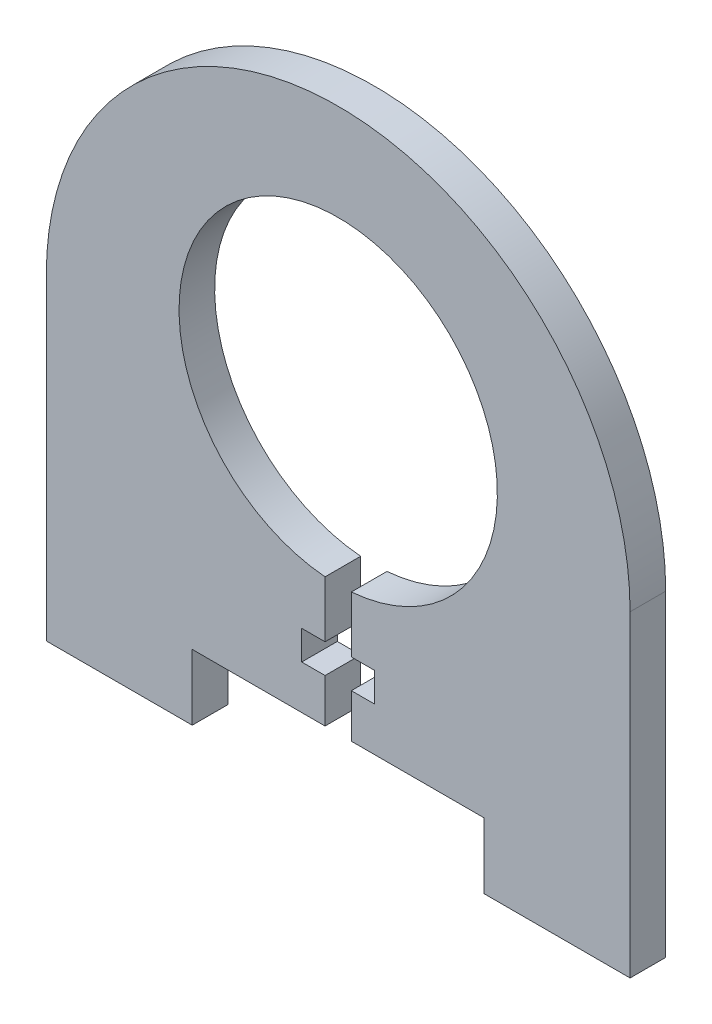
ISO-10303-21;
HEADER;
FILE_DESCRIPTION(('STEP AP214'),'2;1');
FILE_NAME('part.step','',(''),(''),'','','');
FILE_SCHEMA(('AUTOMOTIVE_DESIGN { 1 0 10303 214 1 1 1 1 }'));
ENDSEC;
DATA;
#1=APPLICATION_CONTEXT('core data for automotive mechanical design processes');
#2=APPLICATION_PROTOCOL_DEFINITION('international standard','automotive_design',2000,#1);
#3=PRODUCT_CONTEXT('',#1,'mechanical');
#4=PRODUCT('Part','Part','',(#3));
#5=PRODUCT_RELATED_PRODUCT_CATEGORY('part','',(#4));
#6=PRODUCT_DEFINITION_FORMATION('','',#4);
#7=PRODUCT_DEFINITION_CONTEXT('part definition',#1,'design');
#8=PRODUCT_DEFINITION('design','',#6,#7);
#9=PRODUCT_DEFINITION_SHAPE('','',#8);
#10=(LENGTH_UNIT() NAMED_UNIT(*) SI_UNIT(.MILLI.,.METRE.));
#11=(NAMED_UNIT(*) PLANE_ANGLE_UNIT() SI_UNIT($,.RADIAN.));
#12=(NAMED_UNIT(*) SI_UNIT($,.STERADIAN.) SOLID_ANGLE_UNIT());
#13=UNCERTAINTY_MEASURE_WITH_UNIT(LENGTH_MEASURE(1.E-05),#10,'distance_accuracy_value','');
#14=(GEOMETRIC_REPRESENTATION_CONTEXT(3) GLOBAL_UNCERTAINTY_ASSIGNED_CONTEXT((#13)) GLOBAL_UNIT_ASSIGNED_CONTEXT((#10,
#11,#12)) REPRESENTATION_CONTEXT('',''));
#15=CARTESIAN_POINT('',(0.,0.,0.));
#16=DIRECTION('',(0.,0.,1.));
#17=DIRECTION('',(1.,0.,0.));
#18=AXIS2_PLACEMENT_3D('',#15,#16,#17);
#19=CARTESIAN_POINT('',(-12.7,-8.08507996900001,-0.00100000000000013));
#20=DIRECTION('',(0.,1.,0.));
#21=DIRECTION('',(0.,0.,1.));
#22=AXIS2_PLACEMENT_3D('',#19,#20,#21);
#23=PLANE('',#22);
#24=DIRECTION('',(-1.,0.,0.));
#25=VECTOR('',#24,1.);
#26=CARTESIAN_POINT('',(-12.7,-8.08507996900001,3.0988));
#27=LINE('',#26,#25);
#28=CARTESIAN_POINT('',(12.7,-8.08507996900001,3.0988));
#29=VERTEX_POINT('',#28);
#30=CARTESIAN_POINT('',(1.143,-8.08507996900001,3.0988));
#31=VERTEX_POINT('',#30);
#32=EDGE_CURVE('E211',#29,#31,#27,.T.);
#33=ORIENTED_EDGE('',*,*,#32,.T.);
#34=DIRECTION('',(0.,0.,1.));
#35=VECTOR('',#34,1.);
#36=CARTESIAN_POINT('',(1.143,-8.08507996900001,-0.00100000000000013));
#37=LINE('',#36,#35);
#38=CARTESIAN_POINT('',(1.143,-8.08507996900001,0.));
#39=VERTEX_POINT('',#38);
#40=EDGE_CURVE('E176',#39,#31,#37,.T.);
#41=ORIENTED_EDGE('',*,*,#40,.F.);
#42=DIRECTION('',(-1.,0.,0.));
#43=VECTOR('',#42,1.);
#44=CARTESIAN_POINT('',(-12.7,-8.08507996900001,0.));
#45=LINE('',#44,#43);
#46=CARTESIAN_POINT('',(12.7,-8.08507996900001,0.));
#47=VERTEX_POINT('',#46);
#48=EDGE_CURVE('E194',#47,#39,#45,.T.);
#49=ORIENTED_EDGE('',*,*,#48,.F.);
#50=DIRECTION('',(0.,0.,1.));
#51=VECTOR('',#50,1.);
#52=CARTESIAN_POINT('',(12.7,-8.08507996900001,-0.00100000000000013));
#53=LINE('',#52,#51);
#54=EDGE_CURVE('E217',#47,#29,#53,.T.);
#55=ORIENTED_EDGE('',*,*,#54,.T.);
#56=EDGE_LOOP('',(#33,#41,#49,#55));
#57=FACE_BOUND('',#56,.T.);
#58=ADVANCED_FACE('F33',(#57),#23,.F.);
#59=CARTESIAN_POINT('',(25.4,-13.800079969,3.0988));
#60=DIRECTION('',(0.,1.,0.));
#61=DIRECTION('',(-1.,0.,0.));
#62=AXIS2_PLACEMENT_3D('',#59,#60,#61);
#63=PLANE('',#62);
#64=DIRECTION('',(1.,0.,0.));
#65=VECTOR('',#64,1.);
#66=CARTESIAN_POINT('',(25.4,-13.800079969,0.));
#67=LINE('',#66,#65);
#68=CARTESIAN_POINT('',(-25.4,-13.800079969,0.));
#69=VERTEX_POINT('',#68);
#70=CARTESIAN_POINT('',(-12.7,-13.800079969,0.));
#71=VERTEX_POINT('',#70);
#72=EDGE_CURVE('E247',#69,#71,#67,.T.);
#73=ORIENTED_EDGE('',*,*,#72,.T.);
#74=DIRECTION('',(0.,0.,1.));
#75=VECTOR('',#74,1.);
#76=CARTESIAN_POINT('',(-12.7,-13.800079969,-0.00100000000000013));
#77=LINE('',#76,#75);
#78=CARTESIAN_POINT('',(-12.7,-13.800079969,3.0988));
#79=VERTEX_POINT('',#78);
#80=EDGE_CURVE('E214',#71,#79,#77,.T.);
#81=ORIENTED_EDGE('',*,*,#80,.T.);
#82=DIRECTION('',(1.,0.,0.));
#83=VECTOR('',#82,1.);
#84=CARTESIAN_POINT('',(25.4,-13.800079969,3.0988));
#85=LINE('',#84,#83);
#86=CARTESIAN_POINT('',(-25.4,-13.800079969,3.0988));
#87=VERTEX_POINT('',#86);
#88=EDGE_CURVE('E236',#87,#79,#85,.T.);
#89=ORIENTED_EDGE('',*,*,#88,.F.);
#90=DIRECTION('',(0.,0.,-1.));
#91=VECTOR('',#90,1.);
#92=CARTESIAN_POINT('',(-25.4,-13.800079969,3.0988));
#93=LINE('',#92,#91);
#94=EDGE_CURVE('E41',#87,#69,#93,.T.);
#95=ORIENTED_EDGE('',*,*,#94,.T.);
#96=EDGE_LOOP('',(#73,#81,#89,#95));
#97=FACE_BOUND('',#96,.T.);
#98=ADVANCED_FACE('F260',(#97),#63,.F.);
#99=CARTESIAN_POINT('',(0.,13.800079969,3.0988));
#100=DIRECTION('',(0.,0.,-1.));
#101=DIRECTION('',(-1.,0.,0.));
#102=AXIS2_PLACEMENT_3D('',#99,#100,#101);
#103=CYLINDRICAL_SURFACE('',#102,25.4);
#104=CARTESIAN_POINT('',(0.,13.800079969,0.));
#105=DIRECTION('',(0.,0.,1.));
#106=DIRECTION('',(-1.,0.,0.));
#107=AXIS2_PLACEMENT_3D('',#104,#105,#106);
#108=CIRCLE('',#107,25.4);
#109=CARTESIAN_POINT('',(25.4,13.800079969,0.));
#110=VERTEX_POINT('',#109);
#111=CARTESIAN_POINT('',(-25.4,13.800079969,0.));
#112=VERTEX_POINT('',#111);
#113=EDGE_CURVE('E226',#110,#112,#108,.T.);
#114=ORIENTED_EDGE('',*,*,#113,.T.);
#115=DIRECTION('',(0.,0.,-1.));
#116=VECTOR('',#115,1.);
#117=CARTESIAN_POINT('',(-25.4,13.800079969,3.0988));
#118=LINE('',#117,#116);
#119=CARTESIAN_POINT('',(-25.4,13.800079969,3.0988));
#120=VERTEX_POINT('',#119);
#121=EDGE_CURVE('E11',#120,#112,#118,.T.);
#122=ORIENTED_EDGE('',*,*,#121,.F.);
#123=CARTESIAN_POINT('',(0.,13.800079969,3.0988));
#124=DIRECTION('',(0.,0.,1.));
#125=DIRECTION('',(-1.,0.,0.));
#126=AXIS2_PLACEMENT_3D('',#123,#124,#125);
#127=CIRCLE('',#126,25.4);
#128=CARTESIAN_POINT('',(25.4,13.800079969,3.0988));
#129=VERTEX_POINT('',#128);
#130=EDGE_CURVE('E229',#129,#120,#127,.T.);
#131=ORIENTED_EDGE('',*,*,#130,.F.);
#132=DIRECTION('',(0.,0.,-1.));
#133=VECTOR('',#132,1.);
#134=CARTESIAN_POINT('',(25.4,13.800079969,3.0988));
#135=LINE('',#134,#133);
#136=EDGE_CURVE('E241',#129,#110,#135,.T.);
#137=ORIENTED_EDGE('',*,*,#136,.T.);
#138=EDGE_LOOP('',(#114,#122,#131,#137));
#139=FACE_BOUND('',#138,.T.);
#140=ADVANCED_FACE('F35',(#139),#103,.T.);
#141=CARTESIAN_POINT('',(-25.4,-13.800079969,3.0988));
#142=DIRECTION('',(1.,0.,0.));
#143=DIRECTION('',(0.,1.,0.));
#144=AXIS2_PLACEMENT_3D('',#141,#142,#143);
#145=PLANE('',#144);
#146=DIRECTION('',(0.,-1.,0.));
#147=VECTOR('',#146,1.);
#148=CARTESIAN_POINT('',(-25.4,-13.800079969,0.));
#149=LINE('',#148,#147);
#150=EDGE_CURVE('E244',#112,#69,#149,.T.);
#151=ORIENTED_EDGE('',*,*,#150,.T.);
#152=ORIENTED_EDGE('',*,*,#94,.F.);
#153=DIRECTION('',(0.,-1.,0.));
#154=VECTOR('',#153,1.);
#155=CARTESIAN_POINT('',(-25.4,-13.800079969,3.0988));
#156=LINE('',#155,#154);
#157=EDGE_CURVE('E232',#120,#87,#156,.T.);
#158=ORIENTED_EDGE('',*,*,#157,.F.);
#159=ORIENTED_EDGE('',*,*,#121,.T.);
#160=EDGE_LOOP('',(#151,#152,#158,#159));
#161=FACE_BOUND('',#160,.T.);
#162=ADVANCED_FACE('F271',(#161),#145,.F.);
#163=CARTESIAN_POINT('',(12.7,-13.800079969,3.0988));
#164=VERTEX_POINT('',#163);
#165=CARTESIAN_POINT('',(25.4,-13.800079969,3.0988));
#166=VERTEX_POINT('',#165);
#167=EDGE_CURVE('E235',#164,#166,#85,.T.);
#168=ORIENTED_EDGE('',*,*,#167,.F.);
#169=DIRECTION('',(0.,0.,1.));
#170=VECTOR('',#169,1.);
#171=CARTESIAN_POINT('',(12.7,-13.800079969,-0.00100000000000013));
#172=LINE('',#171,#170);
#173=CARTESIAN_POINT('',(12.7,-13.800079969,0.));
#174=VERTEX_POINT('',#173);
#175=EDGE_CURVE('E219',#174,#164,#172,.T.);
#176=ORIENTED_EDGE('',*,*,#175,.F.);
#177=CARTESIAN_POINT('',(25.4,-13.800079969,0.));
#178=VERTEX_POINT('',#177);
#179=EDGE_CURVE('E246',#174,#178,#67,.T.);
#180=ORIENTED_EDGE('',*,*,#179,.T.);
#181=DIRECTION('',(0.,0.,-1.));
#182=VECTOR('',#181,1.);
#183=CARTESIAN_POINT('',(25.4,-13.800079969,3.0988));
#184=LINE('',#183,#182);
#185=EDGE_CURVE('E253',#166,#178,#184,.T.);
#186=ORIENTED_EDGE('',*,*,#185,.F.);
#187=EDGE_LOOP('',(#168,#176,#180,#186));
#188=FACE_BOUND('',#187,.T.);
#189=ADVANCED_FACE('F282',(#188),#63,.F.);
#190=CARTESIAN_POINT('',(25.4,-13.800079969,3.0988));
#191=DIRECTION('',(-1.,0.,0.));
#192=DIRECTION('',(0.,-1.,0.));
#193=AXIS2_PLACEMENT_3D('',#190,#191,#192);
#194=PLANE('',#193);
#195=DIRECTION('',(0.,1.,0.));
#196=VECTOR('',#195,1.);
#197=CARTESIAN_POINT('',(25.4,-13.800079969,0.));
#198=LINE('',#197,#196);
#199=EDGE_CURVE('E233',#178,#110,#198,.T.);
#200=ORIENTED_EDGE('',*,*,#199,.T.);
#201=ORIENTED_EDGE('',*,*,#136,.F.);
#202=DIRECTION('',(0.,1.,0.));
#203=VECTOR('',#202,1.);
#204=CARTESIAN_POINT('',(25.4,-13.800079969,3.0988));
#205=LINE('',#204,#203);
#206=EDGE_CURVE('E239',#166,#129,#205,.T.);
#207=ORIENTED_EDGE('',*,*,#206,.F.);
#208=ORIENTED_EDGE('',*,*,#185,.T.);
#209=EDGE_LOOP('',(#200,#201,#207,#208));
#210=FACE_BOUND('',#209,.T.);
#211=ADVANCED_FACE('F277',(#210),#194,.F.);
#212=CARTESIAN_POINT('',(0.,13.800079969,3.0988));
#213=DIRECTION('',(0.,0.,-1.));
#214=DIRECTION('',(-1.,0.,0.));
#215=AXIS2_PLACEMENT_3D('',#212,#213,#214);
#216=PLANE('',#215);
#217=CARTESIAN_POINT('',(0.,16.964919969,3.0988));
#218=DIRECTION('',(0.,0.,1.));
#219=DIRECTION('',(1.,0.,0.));
#220=AXIS2_PLACEMENT_3D('',#217,#218,#219);
#221=CIRCLE('',#220,13.85);
#222=CARTESIAN_POINT('',(1.143,3.16216477302552,3.0988));
#223=VERTEX_POINT('',#222);
#224=CARTESIAN_POINT('',(-1.143,3.16216477302553,3.0988));
#225=VERTEX_POINT('',#224);
#226=EDGE_CURVE('E223',#223,#225,#221,.T.);
#227=ORIENTED_EDGE('',*,*,#226,.F.);
#228=DIRECTION('',(0.,1.,0.));
#229=VECTOR('',#228,1.);
#230=CARTESIAN_POINT('',(1.143,-1.73507996900001,3.0988));
#231=LINE('',#230,#229);
#232=CARTESIAN_POINT('',(1.143,-1.73507996900001,3.0988));
#233=VERTEX_POINT('',#232);
#234=EDGE_CURVE('E331',#233,#223,#231,.T.);
#235=ORIENTED_EDGE('',*,*,#234,.F.);
#236=DIRECTION('',(-1.,0.,0.));
#237=VECTOR('',#236,1.);
#238=CARTESIAN_POINT('',(3.175,-1.73507996900001,3.0988));
#239=LINE('',#238,#237);
#240=CARTESIAN_POINT('',(3.175,-1.73507996900001,3.0988));
#241=VERTEX_POINT('',#240);
#242=EDGE_CURVE('E328',#241,#233,#239,.T.);
#243=ORIENTED_EDGE('',*,*,#242,.F.);
#244=DIRECTION('',(0.,1.,0.));
#245=VECTOR('',#244,1.);
#246=CARTESIAN_POINT('',(3.175,-4.27507996900001,3.0988));
#247=LINE('',#246,#245);
#248=CARTESIAN_POINT('',(3.175,-4.27507996900001,3.0988));
#249=VERTEX_POINT('',#248);
#250=EDGE_CURVE('E325',#249,#241,#247,.T.);
#251=ORIENTED_EDGE('',*,*,#250,.F.);
#252=DIRECTION('',(1.,0.,0.));
#253=VECTOR('',#252,1.);
#254=CARTESIAN_POINT('',(3.175,-4.27507996900001,3.0988));
#255=LINE('',#254,#253);
#256=CARTESIAN_POINT('',(1.143,-4.27507996900001,3.0988));
#257=VERTEX_POINT('',#256);
#258=EDGE_CURVE('E322',#257,#249,#255,.T.);
#259=ORIENTED_EDGE('',*,*,#258,.F.);
#260=DIRECTION('',(0.,1.,0.));
#261=VECTOR('',#260,1.);
#262=CARTESIAN_POINT('',(1.143,-8.08507996900001,3.0988));
#263=LINE('',#262,#261);
#264=EDGE_CURVE('E291',#31,#257,#263,.T.);
#265=ORIENTED_EDGE('',*,*,#264,.F.);
#266=ORIENTED_EDGE('',*,*,#32,.F.);
#267=DIRECTION('',(0.,1.,0.));
#268=VECTOR('',#267,1.);
#269=CARTESIAN_POINT('',(12.7,-13.800079969,3.0988));
#270=LINE('',#269,#268);
#271=EDGE_CURVE('E207',#164,#29,#270,.T.);
#272=ORIENTED_EDGE('',*,*,#271,.F.);
#273=ORIENTED_EDGE('',*,*,#167,.T.);
#274=ORIENTED_EDGE('',*,*,#206,.T.);
#275=ORIENTED_EDGE('',*,*,#130,.T.);
#276=ORIENTED_EDGE('',*,*,#157,.T.);
#277=ORIENTED_EDGE('',*,*,#88,.T.);
#278=DIRECTION('',(0.,-1.,0.));
#279=VECTOR('',#278,1.);
#280=CARTESIAN_POINT('',(-12.7,-13.800079969,3.0988));
#281=LINE('',#280,#279);
#282=CARTESIAN_POINT('',(-12.7,-8.08507996900001,3.0988));
#283=VERTEX_POINT('',#282);
#284=EDGE_CURVE('E205',#283,#79,#281,.T.);
#285=ORIENTED_EDGE('',*,*,#284,.F.);
#286=CARTESIAN_POINT('',(-1.143,-8.08507996900001,3.0988));
#287=VERTEX_POINT('',#286);
#288=EDGE_CURVE('E210',#287,#283,#27,.T.);
#289=ORIENTED_EDGE('',*,*,#288,.F.);
#290=DIRECTION('',(0.,-1.,0.));
#291=VECTOR('',#290,1.);
#292=CARTESIAN_POINT('',(-1.143,-8.08507996900001,3.0988));
#293=LINE('',#292,#291);
#294=CARTESIAN_POINT('',(-1.143,-4.27507996900001,3.0988));
#295=VERTEX_POINT('',#294);
#296=EDGE_CURVE('E56',#295,#287,#293,.T.);
#297=ORIENTED_EDGE('',*,*,#296,.F.);
#298=DIRECTION('',(1.,0.,0.));
#299=VECTOR('',#298,1.);
#300=CARTESIAN_POINT('',(-1.143,-4.27507996900001,3.0988));
#301=LINE('',#300,#299);
#302=CARTESIAN_POINT('',(-3.17499999999999,-4.27507996900001,3.0988));
#303=VERTEX_POINT('',#302);
#304=EDGE_CURVE('E317',#303,#295,#301,.T.);
#305=ORIENTED_EDGE('',*,*,#304,.F.);
#306=DIRECTION('',(0.,-1.,0.));
#307=VECTOR('',#306,1.);
#308=CARTESIAN_POINT('',(-3.17499999999999,-4.27507996900001,3.0988));
#309=LINE('',#308,#307);
#310=CARTESIAN_POINT('',(-3.17499999999999,-1.73507996900001,3.0988));
#311=VERTEX_POINT('',#310);
#312=EDGE_CURVE('E314',#311,#303,#309,.T.);
#313=ORIENTED_EDGE('',*,*,#312,.F.);
#314=DIRECTION('',(-1.,0.,0.));
#315=VECTOR('',#314,1.);
#316=CARTESIAN_POINT('',(-1.143,-1.73507996900001,3.0988));
#317=LINE('',#316,#315);
#318=CARTESIAN_POINT('',(-1.143,-1.73507996900001,3.0988));
#319=VERTEX_POINT('',#318);
#320=EDGE_CURVE('E311',#319,#311,#317,.T.);
#321=ORIENTED_EDGE('',*,*,#320,.F.);
#322=DIRECTION('',(0.,-1.,0.));
#323=VECTOR('',#322,1.);
#324=CARTESIAN_POINT('',(-1.143,-1.73507996900001,3.0988));
#325=LINE('',#324,#323);
#326=EDGE_CURVE('E333',#225,#319,#325,.T.);
#327=ORIENTED_EDGE('',*,*,#326,.F.);
#328=EDGE_LOOP('',(#227,#235,#243,#251,#259,#265,#266,#272,#273,#274,#275,#276,#277,#285,#289,
#297,#305,#313,#321,#327));
#329=FACE_BOUND('',#328,.T.);
#330=ADVANCED_FACE('F268',(#329),#216,.F.);
#331=CARTESIAN_POINT('',(0.,13.800079969,0.));
#332=DIRECTION('',(0.,0.,-1.));
#333=DIRECTION('',(-1.,0.,0.));
#334=AXIS2_PLACEMENT_3D('',#331,#332,#333);
#335=PLANE('',#334);
#336=DIRECTION('',(0.,1.,0.));
#337=VECTOR('',#336,1.);
#338=CARTESIAN_POINT('',(1.143,-1.73507996900001,0.));
#339=LINE('',#338,#337);
#340=CARTESIAN_POINT('',(1.143,-1.73507996900001,0.));
#341=VERTEX_POINT('',#340);
#342=CARTESIAN_POINT('',(1.143,3.16216477302552,0.));
#343=VERTEX_POINT('',#342);
#344=EDGE_CURVE('E309',#341,#343,#339,.T.);
#345=ORIENTED_EDGE('',*,*,#344,.T.);
#346=CARTESIAN_POINT('',(0.,16.964919969,0.));
#347=DIRECTION('',(0.,0.,-1.));
#348=DIRECTION('',(-1.,0.,0.));
#349=AXIS2_PLACEMENT_3D('',#346,#347,#348);
#350=CIRCLE('',#349,13.85);
#351=CARTESIAN_POINT('',(-1.143,3.16216477302553,0.));
#352=VERTEX_POINT('',#351);
#353=EDGE_CURVE('E216',#343,#352,#350,.F.);
#354=ORIENTED_EDGE('',*,*,#353,.T.);
#355=DIRECTION('',(0.,-1.,0.));
#356=VECTOR('',#355,1.);
#357=CARTESIAN_POINT('',(-1.143,-1.73507996900001,0.));
#358=LINE('',#357,#356);
#359=CARTESIAN_POINT('',(-1.143,-1.73507996900001,0.));
#360=VERTEX_POINT('',#359);
#361=EDGE_CURVE('E297',#352,#360,#358,.T.);
#362=ORIENTED_EDGE('',*,*,#361,.T.);
#363=DIRECTION('',(-1.,0.,0.));
#364=VECTOR('',#363,1.);
#365=CARTESIAN_POINT('',(-1.143,-1.73507996900001,0.));
#366=LINE('',#365,#364);
#367=CARTESIAN_POINT('',(-3.17499999999999,-1.73507996900001,0.));
#368=VERTEX_POINT('',#367);
#369=EDGE_CURVE('E188',#360,#368,#366,.T.);
#370=ORIENTED_EDGE('',*,*,#369,.T.);
#371=DIRECTION('',(0.,-1.,0.));
#372=VECTOR('',#371,1.);
#373=CARTESIAN_POINT('',(-3.17499999999999,-4.27507996900001,0.));
#374=LINE('',#373,#372);
#375=CARTESIAN_POINT('',(-3.17499999999999,-4.27507996900001,0.));
#376=VERTEX_POINT('',#375);
#377=EDGE_CURVE('E200',#368,#376,#374,.T.);
#378=ORIENTED_EDGE('',*,*,#377,.T.);
#379=DIRECTION('',(1.,0.,0.));
#380=VECTOR('',#379,1.);
#381=CARTESIAN_POINT('',(-1.143,-4.27507996900001,0.));
#382=LINE('',#381,#380);
#383=CARTESIAN_POINT('',(-1.143,-4.27507996900001,0.));
#384=VERTEX_POINT('',#383);
#385=EDGE_CURVE('E187',#376,#384,#382,.T.);
#386=ORIENTED_EDGE('',*,*,#385,.T.);
#387=DIRECTION('',(0.,-1.,0.));
#388=VECTOR('',#387,1.);
#389=CARTESIAN_POINT('',(-1.143,-8.08507996900001,0.));
#390=LINE('',#389,#388);
#391=CARTESIAN_POINT('',(-1.143,-8.08507996900001,0.));
#392=VERTEX_POINT('',#391);
#393=EDGE_CURVE('E171',#384,#392,#390,.T.);
#394=ORIENTED_EDGE('',*,*,#393,.T.);
#395=CARTESIAN_POINT('',(-12.7,-8.08507996900001,0.));
#396=VERTEX_POINT('',#395);
#397=EDGE_CURVE('E184',#392,#396,#45,.T.);
#398=ORIENTED_EDGE('',*,*,#397,.T.);
#399=DIRECTION('',(0.,-1.,0.));
#400=VECTOR('',#399,1.);
#401=CARTESIAN_POINT('',(-12.7,-13.800079969,0.));
#402=LINE('',#401,#400);
#403=EDGE_CURVE('E198',#396,#71,#402,.T.);
#404=ORIENTED_EDGE('',*,*,#403,.T.);
#405=ORIENTED_EDGE('',*,*,#72,.F.);
#406=ORIENTED_EDGE('',*,*,#150,.F.);
#407=ORIENTED_EDGE('',*,*,#113,.F.);
#408=ORIENTED_EDGE('',*,*,#199,.F.);
#409=ORIENTED_EDGE('',*,*,#179,.F.);
#410=DIRECTION('',(0.,1.,0.));
#411=VECTOR('',#410,1.);
#412=CARTESIAN_POINT('',(12.7,-13.800079969,0.));
#413=LINE('',#412,#411);
#414=EDGE_CURVE('E195',#174,#47,#413,.T.);
#415=ORIENTED_EDGE('',*,*,#414,.T.);
#416=ORIENTED_EDGE('',*,*,#48,.T.);
#417=DIRECTION('',(0.,1.,0.));
#418=VECTOR('',#417,1.);
#419=CARTESIAN_POINT('',(1.143,-8.08507996900001,0.));
#420=LINE('',#419,#418);
#421=CARTESIAN_POINT('',(1.143,-4.27507996900001,0.));
#422=VERTEX_POINT('',#421);
#423=EDGE_CURVE('E48',#39,#422,#420,.T.);
#424=ORIENTED_EDGE('',*,*,#423,.T.);
#425=DIRECTION('',(1.,0.,0.));
#426=VECTOR('',#425,1.);
#427=CARTESIAN_POINT('',(3.175,-4.27507996900001,0.));
#428=LINE('',#427,#426);
#429=CARTESIAN_POINT('',(3.175,-4.27507996900001,0.));
#430=VERTEX_POINT('',#429);
#431=EDGE_CURVE('E296',#422,#430,#428,.T.);
#432=ORIENTED_EDGE('',*,*,#431,.T.);
#433=DIRECTION('',(0.,1.,0.));
#434=VECTOR('',#433,1.);
#435=CARTESIAN_POINT('',(3.175,-4.27507996900001,0.));
#436=LINE('',#435,#434);
#437=CARTESIAN_POINT('',(3.175,-1.73507996900001,0.));
#438=VERTEX_POINT('',#437);
#439=EDGE_CURVE('E299',#430,#438,#436,.T.);
#440=ORIENTED_EDGE('',*,*,#439,.T.);
#441=DIRECTION('',(-1.,0.,0.));
#442=VECTOR('',#441,1.);
#443=CARTESIAN_POINT('',(3.175,-1.73507996900001,0.));
#444=LINE('',#443,#442);
#445=EDGE_CURVE('E306',#438,#341,#444,.T.);
#446=ORIENTED_EDGE('',*,*,#445,.T.);
#447=EDGE_LOOP('',(#345,#354,#362,#370,#378,#386,#394,#398,#404,#405,#406,#407,#408,#409,#415,
#416,#424,#432,#440,#446));
#448=FACE_BOUND('',#447,.T.);
#449=ADVANCED_FACE('F182',(#448),#335,.T.);
#450=CARTESIAN_POINT('',(0.,16.964919969,-0.00100000000000013));
#451=DIRECTION('',(0.,0.,1.));
#452=DIRECTION('',(1.,0.,0.));
#453=AXIS2_PLACEMENT_3D('',#450,#451,#452);
#454=CYLINDRICAL_SURFACE('',#453,13.85);
#455=ORIENTED_EDGE('',*,*,#226,.T.);
#456=DIRECTION('',(0.,0.,1.));
#457=VECTOR('',#456,1.);
#458=CARTESIAN_POINT('',(-1.143,3.16216477302553,-0.00100000000000013));
#459=LINE('',#458,#457);
#460=EDGE_CURVE('E365',#352,#225,#459,.T.);
#461=ORIENTED_EDGE('',*,*,#460,.F.);
#462=ORIENTED_EDGE('',*,*,#353,.F.);
#463=DIRECTION('',(0.,0.,1.));
#464=VECTOR('',#463,1.);
#465=CARTESIAN_POINT('',(1.143,3.16216477302553,-0.00100000000000013));
#466=LINE('',#465,#464);
#467=EDGE_CURVE('E367',#223,#343,#466,.F.);
#468=ORIENTED_EDGE('',*,*,#467,.F.);
#469=EDGE_LOOP('',(#455,#461,#462,#468));
#470=FACE_BOUND('',#469,.T.);
#471=ADVANCED_FACE('F378',(#470),#454,.F.);
#472=CARTESIAN_POINT('',(-12.7,-13.800079969,-0.00100000000000013));
#473=DIRECTION('',(-1.,0.,0.));
#474=DIRECTION('',(0.,0.,1.));
#475=AXIS2_PLACEMENT_3D('',#472,#473,#474);
#476=PLANE('',#475);
#477=DIRECTION('',(0.,0.,1.));
#478=VECTOR('',#477,1.);
#479=CARTESIAN_POINT('',(-12.7,-8.08507996900001,-0.00100000000000013));
#480=LINE('',#479,#478);
#481=EDGE_CURVE('E193',#396,#283,#480,.T.);
#482=ORIENTED_EDGE('',*,*,#481,.T.);
#483=ORIENTED_EDGE('',*,*,#284,.T.);
#484=ORIENTED_EDGE('',*,*,#80,.F.);
#485=ORIENTED_EDGE('',*,*,#403,.F.);
#486=EDGE_LOOP('',(#482,#483,#484,#485));
#487=FACE_BOUND('',#486,.T.);
#488=ADVANCED_FACE('F264',(#487),#476,.F.);
#489=ORIENTED_EDGE('',*,*,#397,.F.);
#490=DIRECTION('',(0.,0.,1.));
#491=VECTOR('',#490,1.);
#492=CARTESIAN_POINT('',(-1.143,-8.08507996900001,-0.00100000000000013));
#493=LINE('',#492,#491);
#494=EDGE_CURVE('E168',#392,#287,#493,.T.);
#495=ORIENTED_EDGE('',*,*,#494,.T.);
#496=ORIENTED_EDGE('',*,*,#288,.T.);
#497=ORIENTED_EDGE('',*,*,#481,.F.);
#498=EDGE_LOOP('',(#489,#495,#496,#497));
#499=FACE_BOUND('',#498,.T.);
#500=ADVANCED_FACE('F191',(#499),#23,.F.);
#501=CARTESIAN_POINT('',(12.7,-13.800079969,-0.00100000000000013));
#502=DIRECTION('',(1.,0.,0.));
#503=DIRECTION('',(0.,0.,-1.));
#504=AXIS2_PLACEMENT_3D('',#501,#502,#503);
#505=PLANE('',#504);
#506=ORIENTED_EDGE('',*,*,#175,.T.);
#507=ORIENTED_EDGE('',*,*,#271,.T.);
#508=ORIENTED_EDGE('',*,*,#54,.F.);
#509=ORIENTED_EDGE('',*,*,#414,.F.);
#510=EDGE_LOOP('',(#506,#507,#508,#509));
#511=FACE_BOUND('',#510,.T.);
#512=ADVANCED_FACE('F286',(#511),#505,.F.);
#513=CARTESIAN_POINT('',(-1.143,-8.08507996900001,-0.00100000000000013));
#514=DIRECTION('',(-1.,0.,0.));
#515=DIRECTION('',(0.,-1.,0.));
#516=AXIS2_PLACEMENT_3D('',#513,#514,#515);
#517=PLANE('',#516);
#518=DIRECTION('',(0.,0.,1.));
#519=VECTOR('',#518,1.);
#520=CARTESIAN_POINT('',(-1.143,-4.27507996900001,-0.00100000000000013));
#521=LINE('',#520,#519);
#522=EDGE_CURVE('E177',#384,#295,#521,.T.);
#523=ORIENTED_EDGE('',*,*,#522,.T.);
#524=ORIENTED_EDGE('',*,*,#296,.T.);
#525=ORIENTED_EDGE('',*,*,#494,.F.);
#526=ORIENTED_EDGE('',*,*,#393,.F.);
#527=EDGE_LOOP('',(#523,#524,#525,#526));
#528=FACE_BOUND('',#527,.T.);
#529=ADVANCED_FACE('F170',(#528),#517,.F.);
#530=CARTESIAN_POINT('',(-3.17499999999999,-4.27507996900001,-0.00100000000000013));
#531=DIRECTION('',(-1.,0.,0.));
#532=DIRECTION('',(0.,0.,1.));
#533=AXIS2_PLACEMENT_3D('',#530,#531,#532);
#534=PLANE('',#533);
#535=DIRECTION('',(0.,0.,1.));
#536=VECTOR('',#535,1.);
#537=CARTESIAN_POINT('',(-3.17499999999999,-1.73507996900001,-0.00100000000000013));
#538=LINE('',#537,#536);
#539=EDGE_CURVE('E336',#368,#311,#538,.T.);
#540=ORIENTED_EDGE('',*,*,#539,.T.);
#541=ORIENTED_EDGE('',*,*,#312,.T.);
#542=DIRECTION('',(0.,0.,1.));
#543=VECTOR('',#542,1.);
#544=CARTESIAN_POINT('',(-3.17499999999999,-4.27507996900001,-0.00100000000000013));
#545=LINE('',#544,#543);
#546=EDGE_CURVE('E349',#376,#303,#545,.T.);
#547=ORIENTED_EDGE('',*,*,#546,.F.);
#548=ORIENTED_EDGE('',*,*,#377,.F.);
#549=EDGE_LOOP('',(#540,#541,#547,#548));
#550=FACE_BOUND('',#549,.T.);
#551=ADVANCED_FACE('F355',(#550),#534,.F.);
#552=CARTESIAN_POINT('',(-1.143,-4.27507996900001,-0.00100000000000013));
#553=DIRECTION('',(0.,-1.,0.));
#554=DIRECTION('',(0.,0.,-1.));
#555=AXIS2_PLACEMENT_3D('',#552,#553,#554);
#556=PLANE('',#555);
#557=ORIENTED_EDGE('',*,*,#546,.T.);
#558=ORIENTED_EDGE('',*,*,#304,.T.);
#559=ORIENTED_EDGE('',*,*,#522,.F.);
#560=ORIENTED_EDGE('',*,*,#385,.F.);
#561=EDGE_LOOP('',(#557,#558,#559,#560));
#562=FACE_BOUND('',#561,.T.);
#563=ADVANCED_FACE('F364',(#562),#556,.F.);
#564=CARTESIAN_POINT('',(-1.143,-1.73507996900001,-0.00100000000000013));
#565=DIRECTION('',(-1.,0.,0.));
#566=DIRECTION('',(0.,-1.,0.));
#567=AXIS2_PLACEMENT_3D('',#564,#565,#566);
#568=PLANE('',#567);
#569=ORIENTED_EDGE('',*,*,#460,.T.);
#570=ORIENTED_EDGE('',*,*,#326,.T.);
#571=DIRECTION('',(0.,0.,1.));
#572=VECTOR('',#571,1.);
#573=CARTESIAN_POINT('',(-1.143,-1.73507996900001,-0.00100000000000013));
#574=LINE('',#573,#572);
#575=EDGE_CURVE('E337',#360,#319,#574,.T.);
#576=ORIENTED_EDGE('',*,*,#575,.F.);
#577=ORIENTED_EDGE('',*,*,#361,.F.);
#578=EDGE_LOOP('',(#569,#570,#576,#577));
#579=FACE_BOUND('',#578,.T.);
#580=ADVANCED_FACE('F380',(#579),#568,.F.);
#581=CARTESIAN_POINT('',(-1.143,-1.73507996900001,-0.00100000000000013));
#582=DIRECTION('',(0.,1.,0.));
#583=DIRECTION('',(-1.,0.,0.));
#584=AXIS2_PLACEMENT_3D('',#581,#582,#583);
#585=PLANE('',#584);
#586=ORIENTED_EDGE('',*,*,#575,.T.);
#587=ORIENTED_EDGE('',*,*,#320,.T.);
#588=ORIENTED_EDGE('',*,*,#539,.F.);
#589=ORIENTED_EDGE('',*,*,#369,.F.);
#590=EDGE_LOOP('',(#586,#587,#588,#589));
#591=FACE_BOUND('',#590,.T.);
#592=ADVANCED_FACE('F357',(#591),#585,.F.);
#593=CARTESIAN_POINT('',(1.143,-1.73507996900001,-0.00100000000000013));
#594=DIRECTION('',(1.,0.,0.));
#595=DIRECTION('',(0.,1.,0.));
#596=AXIS2_PLACEMENT_3D('',#593,#594,#595);
#597=PLANE('',#596);
#598=DIRECTION('',(0.,0.,1.));
#599=VECTOR('',#598,1.);
#600=CARTESIAN_POINT('',(1.143,-1.73507996900001,-0.00100000000000013));
#601=LINE('',#600,#599);
#602=EDGE_CURVE('E339',#341,#233,#601,.T.);
#603=ORIENTED_EDGE('',*,*,#602,.T.);
#604=ORIENTED_EDGE('',*,*,#234,.T.);
#605=ORIENTED_EDGE('',*,*,#467,.T.);
#606=ORIENTED_EDGE('',*,*,#344,.F.);
#607=EDGE_LOOP('',(#603,#604,#605,#606));
#608=FACE_BOUND('',#607,.T.);
#609=ADVANCED_FACE('F372',(#608),#597,.F.);
#610=CARTESIAN_POINT('',(3.175,-1.73507996900001,-0.00100000000000013));
#611=DIRECTION('',(0.,1.,0.));
#612=DIRECTION('',(-1.,0.,0.));
#613=AXIS2_PLACEMENT_3D('',#610,#611,#612);
#614=PLANE('',#613);
#615=DIRECTION('',(0.,0.,1.));
#616=VECTOR('',#615,1.);
#617=CARTESIAN_POINT('',(3.175,-1.73507996900001,-0.00100000000000013));
#618=LINE('',#617,#616);
#619=EDGE_CURVE('E341',#438,#241,#618,.T.);
#620=ORIENTED_EDGE('',*,*,#619,.T.);
#621=ORIENTED_EDGE('',*,*,#242,.T.);
#622=ORIENTED_EDGE('',*,*,#602,.F.);
#623=ORIENTED_EDGE('',*,*,#445,.F.);
#624=EDGE_LOOP('',(#620,#621,#622,#623));
#625=FACE_BOUND('',#624,.T.);
#626=ADVANCED_FACE('F384',(#625),#614,.F.);
#627=CARTESIAN_POINT('',(3.175,-4.27507996900001,-0.00100000000000013));
#628=DIRECTION('',(1.,0.,0.));
#629=DIRECTION('',(0.,0.,-1.));
#630=AXIS2_PLACEMENT_3D('',#627,#628,#629);
#631=PLANE('',#630);
#632=DIRECTION('',(0.,0.,1.));
#633=VECTOR('',#632,1.);
#634=CARTESIAN_POINT('',(3.175,-4.27507996900001,-0.00100000000000013));
#635=LINE('',#634,#633);
#636=EDGE_CURVE('E343',#430,#249,#635,.T.);
#637=ORIENTED_EDGE('',*,*,#636,.T.);
#638=ORIENTED_EDGE('',*,*,#250,.T.);
#639=ORIENTED_EDGE('',*,*,#619,.F.);
#640=ORIENTED_EDGE('',*,*,#439,.F.);
#641=EDGE_LOOP('',(#637,#638,#639,#640));
#642=FACE_BOUND('',#641,.T.);
#643=ADVANCED_FACE('F387',(#642),#631,.F.);
#644=CARTESIAN_POINT('',(3.175,-4.27507996900001,-0.00100000000000013));
#645=DIRECTION('',(0.,-1.,0.));
#646=DIRECTION('',(1.,0.,0.));
#647=AXIS2_PLACEMENT_3D('',#644,#645,#646);
#648=PLANE('',#647);
#649=DIRECTION('',(0.,0.,1.));
#650=VECTOR('',#649,1.);
#651=CARTESIAN_POINT('',(1.143,-4.27507996900001,-0.00100000000000013));
#652=LINE('',#651,#650);
#653=EDGE_CURVE('E345',#422,#257,#652,.T.);
#654=ORIENTED_EDGE('',*,*,#653,.T.);
#655=ORIENTED_EDGE('',*,*,#258,.T.);
#656=ORIENTED_EDGE('',*,*,#636,.F.);
#657=ORIENTED_EDGE('',*,*,#431,.F.);
#658=EDGE_LOOP('',(#654,#655,#656,#657));
#659=FACE_BOUND('',#658,.T.);
#660=ADVANCED_FACE('F390',(#659),#648,.F.);
#661=CARTESIAN_POINT('',(1.143,-8.08507996900001,-0.00100000000000013));
#662=DIRECTION('',(1.,0.,0.));
#663=DIRECTION('',(0.,1.,0.));
#664=AXIS2_PLACEMENT_3D('',#661,#662,#663);
#665=PLANE('',#664);
#666=ORIENTED_EDGE('',*,*,#40,.T.);
#667=ORIENTED_EDGE('',*,*,#264,.T.);
#668=ORIENTED_EDGE('',*,*,#653,.F.);
#669=ORIENTED_EDGE('',*,*,#423,.F.);
#670=EDGE_LOOP('',(#666,#667,#668,#669));
#671=FACE_BOUND('',#670,.T.);
#672=ADVANCED_FACE('F391',(#671),#665,.F.);
#673=CLOSED_SHELL('',(#58,#98,#140,#162,#189,#211,#330,#449,#471,#488,#500,#512,#529,#551,#563,
#580,#592,#609,#626,#643,#660,#672));
#674=MANIFOLD_SOLID_BREP('B2',#673);
#675=ADVANCED_BREP_SHAPE_REPRESENTATION('',(#18,#674),#14);
#676=SHAPE_DEFINITION_REPRESENTATION(#9,#675);
ENDSEC;
END-ISO-10303-21;
